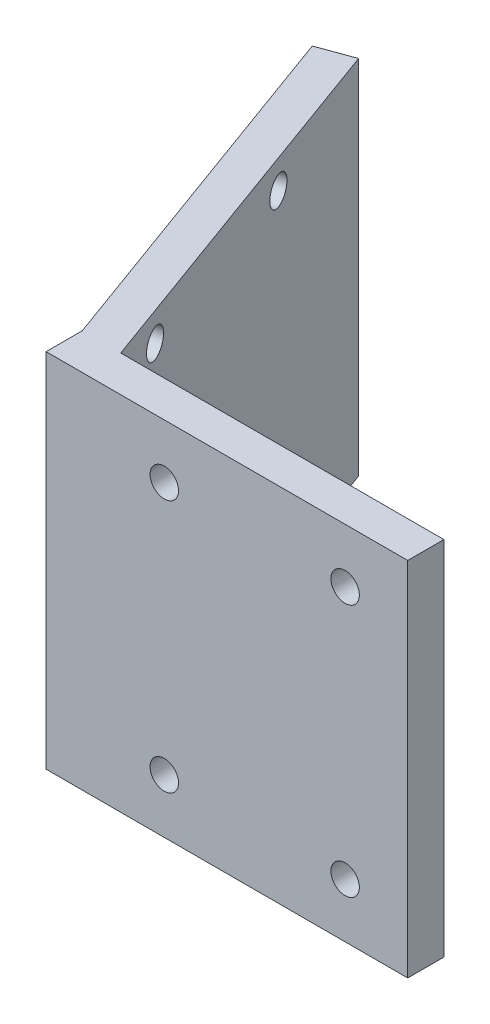
ISO-10303-21;
HEADER;
FILE_DESCRIPTION(('STEP AP214'),'2;1');
FILE_NAME('part.step','',(''),(''),'','','');
FILE_SCHEMA(('AUTOMOTIVE_DESIGN { 1 0 10303 214 1 1 1 1 }'));
ENDSEC;
DATA;
#1=APPLICATION_CONTEXT('core data for automotive mechanical design processes');
#2=APPLICATION_PROTOCOL_DEFINITION('international standard','automotive_design',2000,#1);
#3=PRODUCT_CONTEXT('',#1,'mechanical');
#4=PRODUCT('Part','Part','',(#3));
#5=PRODUCT_RELATED_PRODUCT_CATEGORY('part','',(#4));
#6=PRODUCT_DEFINITION_FORMATION('','',#4);
#7=PRODUCT_DEFINITION_CONTEXT('part definition',#1,'design');
#8=PRODUCT_DEFINITION('design','',#6,#7);
#9=PRODUCT_DEFINITION_SHAPE('','',#8);
#10=(LENGTH_UNIT() NAMED_UNIT(*) SI_UNIT(.MILLI.,.METRE.));
#11=(NAMED_UNIT(*) PLANE_ANGLE_UNIT() SI_UNIT($,.RADIAN.));
#12=(NAMED_UNIT(*) SI_UNIT($,.STERADIAN.) SOLID_ANGLE_UNIT());
#13=UNCERTAINTY_MEASURE_WITH_UNIT(LENGTH_MEASURE(1.E-05),#10,'distance_accuracy_value','');
#14=(GEOMETRIC_REPRESENTATION_CONTEXT(3) GLOBAL_UNCERTAINTY_ASSIGNED_CONTEXT((#13)) GLOBAL_UNIT_ASSIGNED_CONTEXT((#10,
#11,#12)) REPRESENTATION_CONTEXT('',''));
#15=CARTESIAN_POINT('',(0.,0.,0.));
#16=DIRECTION('',(0.,0.,1.));
#17=DIRECTION('',(1.,0.,0.));
#18=AXIS2_PLACEMENT_3D('',#15,#16,#17);
#19=CARTESIAN_POINT('',(0.,25.4,0.));
#20=DIRECTION('',(0.939692620785908,0.,-0.34202014332567));
#21=DIRECTION('',(-0.34202014332567,0.,-0.939692620785908));
#22=AXIS2_PLACEMENT_3D('',#19,#20,#21);
#23=PLANE('',#22);
#24=CARTESIAN_POINT('',(-1.0616700011516,23.4,-2.91691435507637));
#25=DIRECTION('',(0.939692620785908,0.,-0.34202014332567));
#26=DIRECTION('',(-0.34202014332567,0.,-0.939692620785908));
#27=AXIS2_PLACEMENT_3D('',#24,#25,#26);
#28=CIRCLE('',#27,0.999999999999999);
#29=CARTESIAN_POINT('',(-0.719649857825928,23.4,-1.97722173429046));
#30=VERTEX_POINT('',#29);
#31=EDGE_CURVE('E165',#30,#30,#28,.T.);
#32=ORIENTED_EDGE('',*,*,#31,.T.);
#33=EDGE_LOOP('',(#32));
#34=FACE_BOUND('',#33,.T.);
#35=CARTESIAN_POINT('',(-1.0616700011516,2.,-2.91691435507637));
#36=DIRECTION('',(-0.939692620785908,0.,0.34202014332567));
#37=DIRECTION('',(0.34202014332567,0.,0.939692620785908));
#38=AXIS2_PLACEMENT_3D('',#35,#36,#37);
#39=CIRCLE('',#38,1.);
#40=CARTESIAN_POINT('',(-0.719649857825928,2.,-1.97722173429046));
#41=VERTEX_POINT('',#40);
#42=EDGE_CURVE('E155',#41,#41,#39,.T.);
#43=ORIENTED_EDGE('',*,*,#42,.F.);
#44=EDGE_LOOP('',(#43));
#45=FACE_BOUND('',#44,.T.);
#46=CARTESIAN_POINT('',(-6.02096207937381,23.4,-16.542457356472));
#47=DIRECTION('',(0.939692620785908,0.,-0.34202014332567));
#48=DIRECTION('',(-0.34202014332567,0.,-0.939692620785908));
#49=AXIS2_PLACEMENT_3D('',#46,#47,#48);
#50=CIRCLE('',#49,1.);
#51=CARTESIAN_POINT('',(-5.67894193604814,23.4,-15.6027647356861));
#52=VERTEX_POINT('',#51);
#53=EDGE_CURVE('E152',#52,#52,#50,.T.);
#54=ORIENTED_EDGE('',*,*,#53,.T.);
#55=EDGE_LOOP('',(#54));
#56=FACE_BOUND('',#55,.T.);
#57=CARTESIAN_POINT('',(-6.02096207937381,2.,-16.542457356472));
#58=DIRECTION('',(-0.939692620785908,0.,0.34202014332567));
#59=DIRECTION('',(0.34202014332567,0.,0.939692620785908));
#60=AXIS2_PLACEMENT_3D('',#57,#58,#59);
#61=CIRCLE('',#60,1.);
#62=CARTESIAN_POINT('',(-5.67894193604814,2.,-15.6027647356861));
#63=VERTEX_POINT('',#62);
#64=EDGE_CURVE('E149',#63,#63,#61,.T.);
#65=ORIENTED_EDGE('',*,*,#64,.F.);
#66=EDGE_LOOP('',(#65));
#67=FACE_BOUND('',#66,.T.);
#68=DIRECTION('',(0.34202014332567,0.,0.939692620785908));
#69=VECTOR('',#68,1.);
#70=CARTESIAN_POINT('',(0.,0.,0.));
#71=LINE('',#70,#69);
#72=CARTESIAN_POINT('',(-9.24484395036157,0.,-25.4));
#73=VERTEX_POINT('',#72);
#74=CARTESIAN_POINT('',(0.,0.,0.));
#75=VERTEX_POINT('',#74);
#76=EDGE_CURVE('E125',#73,#75,#71,.T.);
#77=ORIENTED_EDGE('',*,*,#76,.T.);
#78=DIRECTION('',(0.,-1.,0.));
#79=VECTOR('',#78,1.);
#80=CARTESIAN_POINT('',(0.,25.4,0.));
#81=LINE('',#80,#79);
#82=CARTESIAN_POINT('',(0.,25.4,0.));
#83=VERTEX_POINT('',#82);
#84=EDGE_CURVE('E11',#83,#75,#81,.T.);
#85=ORIENTED_EDGE('',*,*,#84,.F.);
#86=DIRECTION('',(0.34202014332567,0.,0.939692620785908));
#87=VECTOR('',#86,1.);
#88=CARTESIAN_POINT('',(0.,25.4,0.));
#89=LINE('',#88,#87);
#90=CARTESIAN_POINT('',(-9.24484395036157,25.4,-25.4));
#91=VERTEX_POINT('',#90);
#92=EDGE_CURVE('E138',#91,#83,#89,.T.);
#93=ORIENTED_EDGE('',*,*,#92,.F.);
#94=DIRECTION('',(0.,-1.,0.));
#95=VECTOR('',#94,1.);
#96=CARTESIAN_POINT('',(-9.24484395036157,25.4,-25.4));
#97=LINE('',#96,#95);
#98=EDGE_CURVE('E121',#91,#73,#97,.T.);
#99=ORIENTED_EDGE('',*,*,#98,.T.);
#100=EDGE_LOOP('',(#77,#85,#93,#99));
#101=FACE_BOUND('',#100,.T.);
#102=ADVANCED_FACE('F33',(#34,#45,#56,#67,#101),#23,.F.);
#103=CARTESIAN_POINT('',(0.,25.4,0.));
#104=DIRECTION('',(1.,0.,0.));
#105=DIRECTION('',(0.,0.,-1.));
#106=AXIS2_PLACEMENT_3D('',#103,#104,#105);
#107=PLANE('',#106);
#108=DIRECTION('',(0.,0.,1.));
#109=VECTOR('',#108,1.);
#110=CARTESIAN_POINT('',(0.,0.,0.));
#111=LINE('',#110,#109);
#112=CARTESIAN_POINT('',(0.,0.,2.54));
#113=VERTEX_POINT('',#112);
#114=EDGE_CURVE('E128',#75,#113,#111,.T.);
#115=ORIENTED_EDGE('',*,*,#114,.T.);
#116=DIRECTION('',(0.,-1.,0.));
#117=VECTOR('',#116,1.);
#118=CARTESIAN_POINT('',(0.,25.4,2.54));
#119=LINE('',#118,#117);
#120=CARTESIAN_POINT('',(0.,25.4,2.54));
#121=VERTEX_POINT('',#120);
#122=EDGE_CURVE('E42',#121,#113,#119,.T.);
#123=ORIENTED_EDGE('',*,*,#122,.F.);
#124=DIRECTION('',(0.,0.,1.));
#125=VECTOR('',#124,1.);
#126=CARTESIAN_POINT('',(0.,25.4,0.));
#127=LINE('',#126,#125);
#128=EDGE_CURVE('E90',#83,#121,#127,.T.);
#129=ORIENTED_EDGE('',*,*,#128,.F.);
#130=ORIENTED_EDGE('',*,*,#84,.T.);
#131=EDGE_LOOP('',(#115,#123,#129,#130));
#132=FACE_BOUND('',#131,.T.);
#133=ADVANCED_FACE('F200',(#132),#107,.F.);
#134=CARTESIAN_POINT('',(0.,25.4,2.54));
#135=DIRECTION('',(0.,0.,-1.));
#136=DIRECTION('',(-1.,0.,0.));
#137=AXIS2_PLACEMENT_3D('',#134,#135,#136);
#138=PLANE('',#137);
#139=CARTESIAN_POINT('',(21.0014964955635,3.81,2.54));
#140=DIRECTION('',(0.,0.,-1.));
#141=DIRECTION('',(-1.,0.,0.));
#142=AXIS2_PLACEMENT_3D('',#139,#140,#141);
#143=CIRCLE('',#142,1.);
#144=CARTESIAN_POINT('',(20.0014964955635,3.81,2.54));
#145=VERTEX_POINT('',#144);
#146=EDGE_CURVE('E257',#145,#145,#143,.T.);
#147=ORIENTED_EDGE('',*,*,#146,.T.);
#148=EDGE_LOOP('',(#147));
#149=FACE_BOUND('',#148,.T.);
#150=CARTESIAN_POINT('',(8.30149649556353,21.59,2.54));
#151=DIRECTION('',(0.,0.,-1.));
#152=DIRECTION('',(-1.,0.,0.));
#153=AXIS2_PLACEMENT_3D('',#150,#151,#152);
#154=CIRCLE('',#153,1.);
#155=CARTESIAN_POINT('',(7.30149649556353,21.59,2.54));
#156=VERTEX_POINT('',#155);
#157=EDGE_CURVE('E260',#156,#156,#154,.T.);
#158=ORIENTED_EDGE('',*,*,#157,.T.);
#159=EDGE_LOOP('',(#158));
#160=FACE_BOUND('',#159,.T.);
#161=CARTESIAN_POINT('',(8.30149649556353,3.81,2.54));
#162=DIRECTION('',(0.,0.,-1.));
#163=DIRECTION('',(-1.,0.,0.));
#164=AXIS2_PLACEMENT_3D('',#161,#162,#163);
#165=CIRCLE('',#164,1.);
#166=CARTESIAN_POINT('',(7.30149649556353,3.81,2.54));
#167=VERTEX_POINT('',#166);
#168=EDGE_CURVE('E266',#167,#167,#165,.T.);
#169=ORIENTED_EDGE('',*,*,#168,.T.);
#170=EDGE_LOOP('',(#169));
#171=FACE_BOUND('',#170,.T.);
#172=CARTESIAN_POINT('',(21.0014964955635,21.59,2.54));
#173=DIRECTION('',(0.,0.,-1.));
#174=DIRECTION('',(-1.,0.,0.));
#175=AXIS2_PLACEMENT_3D('',#172,#173,#174);
#176=CIRCLE('',#175,1.);
#177=CARTESIAN_POINT('',(20.0014964955635,21.59,2.54));
#178=VERTEX_POINT('',#177);
#179=EDGE_CURVE('E263',#178,#178,#176,.T.);
#180=ORIENTED_EDGE('',*,*,#179,.T.);
#181=EDGE_LOOP('',(#180));
#182=FACE_BOUND('',#181,.T.);
#183=DIRECTION('',(1.,0.,0.));
#184=VECTOR('',#183,1.);
#185=CARTESIAN_POINT('',(0.,0.,2.54));
#186=LINE('',#185,#184);
#187=CARTESIAN_POINT('',(25.4,0.,2.54));
#188=VERTEX_POINT('',#187);
#189=EDGE_CURVE('E131',#113,#188,#186,.T.);
#190=ORIENTED_EDGE('',*,*,#189,.T.);
#191=DIRECTION('',(0.,-1.,0.));
#192=VECTOR('',#191,1.);
#193=CARTESIAN_POINT('',(25.4,25.4,2.54));
#194=LINE('',#193,#192);
#195=CARTESIAN_POINT('',(25.4,25.4,2.54));
#196=VERTEX_POINT('',#195);
#197=EDGE_CURVE('E142',#196,#188,#194,.T.);
#198=ORIENTED_EDGE('',*,*,#197,.F.);
#199=DIRECTION('',(1.,0.,0.));
#200=VECTOR('',#199,1.);
#201=CARTESIAN_POINT('',(0.,25.4,2.54));
#202=LINE('',#201,#200);
#203=EDGE_CURVE('E173',#121,#196,#202,.T.);
#204=ORIENTED_EDGE('',*,*,#203,.F.);
#205=ORIENTED_EDGE('',*,*,#122,.T.);
#206=EDGE_LOOP('',(#190,#198,#204,#205));
#207=FACE_BOUND('',#206,.T.);
#208=ADVANCED_FACE('F177',(#149,#160,#171,#182,#207),#138,.F.);
#209=CARTESIAN_POINT('',(25.4,25.4,0.));
#210=DIRECTION('',(-1.,0.,0.));
#211=DIRECTION('',(0.,0.,1.));
#212=AXIS2_PLACEMENT_3D('',#209,#210,#211);
#213=PLANE('',#212);
#214=DIRECTION('',(0.,0.,-1.));
#215=VECTOR('',#214,1.);
#216=CARTESIAN_POINT('',(25.4,0.,0.));
#217=LINE('',#216,#215);
#218=CARTESIAN_POINT('',(25.4,0.,0.));
#219=VERTEX_POINT('',#218);
#220=EDGE_CURVE('E133',#188,#219,#217,.T.);
#221=ORIENTED_EDGE('',*,*,#220,.T.);
#222=DIRECTION('',(0.,-1.,0.));
#223=VECTOR('',#222,1.);
#224=CARTESIAN_POINT('',(25.4,25.4,0.));
#225=LINE('',#224,#223);
#226=CARTESIAN_POINT('',(25.4,25.4,0.));
#227=VERTEX_POINT('',#226);
#228=EDGE_CURVE('E116',#227,#219,#225,.T.);
#229=ORIENTED_EDGE('',*,*,#228,.F.);
#230=DIRECTION('',(0.,0.,-1.));
#231=VECTOR('',#230,1.);
#232=CARTESIAN_POINT('',(25.4,25.4,0.));
#233=LINE('',#232,#231);
#234=EDGE_CURVE('E106',#196,#227,#233,.T.);
#235=ORIENTED_EDGE('',*,*,#234,.F.);
#236=ORIENTED_EDGE('',*,*,#197,.T.);
#237=EDGE_LOOP('',(#221,#229,#235,#236));
#238=FACE_BOUND('',#237,.T.);
#239=ADVANCED_FACE('F181',(#238),#213,.F.);
#240=CARTESIAN_POINT('',(2.70301154208882,25.4,0.));
#241=DIRECTION('',(0.,0.,1.));
#242=DIRECTION('',(1.,0.,0.));
#243=AXIS2_PLACEMENT_3D('',#240,#241,#242);
#244=PLANE('',#243);
#245=CARTESIAN_POINT('',(21.0014964955635,3.81,0.));
#246=DIRECTION('',(0.,0.,-1.));
#247=DIRECTION('',(1.,0.,0.));
#248=AXIS2_PLACEMENT_3D('',#245,#246,#247);
#249=CIRCLE('',#248,1.);
#250=CARTESIAN_POINT('',(22.0014964955635,3.81,0.));
#251=VERTEX_POINT('',#250);
#252=EDGE_CURVE('E254',#251,#251,#249,.T.);
#253=ORIENTED_EDGE('',*,*,#252,.F.);
#254=EDGE_LOOP('',(#253));
#255=FACE_BOUND('',#254,.T.);
#256=CARTESIAN_POINT('',(8.30149649556353,21.59,0.));
#257=DIRECTION('',(0.,0.,-1.));
#258=DIRECTION('',(1.,0.,0.));
#259=AXIS2_PLACEMENT_3D('',#256,#257,#258);
#260=CIRCLE('',#259,1.);
#261=CARTESIAN_POINT('',(9.30149649556353,21.59,0.));
#262=VERTEX_POINT('',#261);
#263=EDGE_CURVE('E289',#262,#262,#260,.T.);
#264=ORIENTED_EDGE('',*,*,#263,.F.);
#265=EDGE_LOOP('',(#264));
#266=FACE_BOUND('',#265,.T.);
#267=CARTESIAN_POINT('',(8.30149649556353,3.81,0.));
#268=DIRECTION('',(0.,0.,-1.));
#269=DIRECTION('',(-1.,0.,0.));
#270=AXIS2_PLACEMENT_3D('',#267,#268,#269);
#271=CIRCLE('',#270,1.);
#272=CARTESIAN_POINT('',(7.30149649556353,3.81,0.));
#273=VERTEX_POINT('',#272);
#274=EDGE_CURVE('E293',#273,#273,#271,.T.);
#275=ORIENTED_EDGE('',*,*,#274,.F.);
#276=EDGE_LOOP('',(#275));
#277=FACE_BOUND('',#276,.T.);
#278=CARTESIAN_POINT('',(21.0014964955635,21.59,0.));
#279=DIRECTION('',(0.,0.,-1.));
#280=DIRECTION('',(-1.,0.,0.));
#281=AXIS2_PLACEMENT_3D('',#278,#279,#280);
#282=CIRCLE('',#281,1.);
#283=CARTESIAN_POINT('',(20.0014964955635,21.59,0.));
#284=VERTEX_POINT('',#283);
#285=EDGE_CURVE('E259',#284,#284,#282,.T.);
#286=ORIENTED_EDGE('',*,*,#285,.F.);
#287=EDGE_LOOP('',(#286));
#288=FACE_BOUND('',#287,.T.);
#289=DIRECTION('',(-1.,0.,0.));
#290=VECTOR('',#289,1.);
#291=CARTESIAN_POINT('',(2.70301154208882,0.,0.));
#292=LINE('',#291,#290);
#293=CARTESIAN_POINT('',(2.70301154208882,0.,0.));
#294=VERTEX_POINT('',#293);
#295=EDGE_CURVE('E115',#219,#294,#292,.T.);
#296=ORIENTED_EDGE('',*,*,#295,.T.);
#297=DIRECTION('',(0.,-1.,0.));
#298=VECTOR('',#297,1.);
#299=CARTESIAN_POINT('',(2.70301154208882,25.4,0.));
#300=LINE('',#299,#298);
#301=CARTESIAN_POINT('',(2.70301154208882,25.4,0.));
#302=VERTEX_POINT('',#301);
#303=EDGE_CURVE('E112',#302,#294,#300,.T.);
#304=ORIENTED_EDGE('',*,*,#303,.F.);
#305=DIRECTION('',(-1.,0.,0.));
#306=VECTOR('',#305,1.);
#307=CARTESIAN_POINT('',(2.70301154208882,25.4,0.));
#308=LINE('',#307,#306);
#309=EDGE_CURVE('E100',#227,#302,#308,.T.);
#310=ORIENTED_EDGE('',*,*,#309,.F.);
#311=ORIENTED_EDGE('',*,*,#228,.T.);
#312=EDGE_LOOP('',(#296,#304,#310,#311));
#313=FACE_BOUND('',#312,.T.);
#314=ADVANCED_FACE('F113',(#255,#266,#277,#288,#313),#244,.F.);
#315=CARTESIAN_POINT('',(2.38681925679621,25.4,-0.868731164047201));
#316=DIRECTION('',(-0.939692620785908,0.,0.34202014332567));
#317=DIRECTION('',(0.34202014332567,0.,0.939692620785908));
#318=AXIS2_PLACEMENT_3D('',#315,#316,#317);
#319=PLANE('',#318);
#320=CARTESIAN_POINT('',(1.32514925564461,23.4,-3.78564551912357));
#321=DIRECTION('',(-0.939692620785908,0.,0.34202014332567));
#322=DIRECTION('',(0.34202014332567,0.,0.939692620785908));
#323=AXIS2_PLACEMENT_3D('',#320,#321,#322);
#324=CIRCLE('',#323,0.999999999999999);
#325=CARTESIAN_POINT('',(1.66716939897028,23.4,-2.84595289833766));
#326=VERTEX_POINT('',#325);
#327=EDGE_CURVE('E36',#326,#326,#324,.F.);
#328=ORIENTED_EDGE('',*,*,#327,.F.);
#329=EDGE_LOOP('',(#328));
#330=FACE_BOUND('',#329,.T.);
#331=CARTESIAN_POINT('',(1.32514925564461,2.,-3.78564551912357));
#332=DIRECTION('',(-0.939692620785908,0.,0.34202014332567));
#333=DIRECTION('',(0.34202014332567,0.,0.939692620785908));
#334=AXIS2_PLACEMENT_3D('',#331,#332,#333);
#335=CIRCLE('',#334,1.);
#336=CARTESIAN_POINT('',(1.66716939897028,2.,-2.84595289833766));
#337=VERTEX_POINT('',#336);
#338=EDGE_CURVE('E153',#337,#337,#335,.T.);
#339=ORIENTED_EDGE('',*,*,#338,.T.);
#340=EDGE_LOOP('',(#339));
#341=FACE_BOUND('',#340,.T.);
#342=CARTESIAN_POINT('',(-3.6341428225776,23.4,-17.4111885205192));
#343=DIRECTION('',(-0.939692620785908,0.,0.34202014332567));
#344=DIRECTION('',(0.34202014332567,0.,0.939692620785908));
#345=AXIS2_PLACEMENT_3D('',#342,#343,#344);
#346=CIRCLE('',#345,1.);
#347=CARTESIAN_POINT('',(-3.29212267925192,23.4,-16.4714958997333));
#348=VERTEX_POINT('',#347);
#349=EDGE_CURVE('E150',#348,#348,#346,.F.);
#350=ORIENTED_EDGE('',*,*,#349,.F.);
#351=EDGE_LOOP('',(#350));
#352=FACE_BOUND('',#351,.T.);
#353=CARTESIAN_POINT('',(-3.6341428225776,2.,-17.4111885205192));
#354=DIRECTION('',(-0.939692620785908,0.,0.34202014332567));
#355=DIRECTION('',(0.34202014332567,0.,0.939692620785908));
#356=AXIS2_PLACEMENT_3D('',#353,#354,#355);
#357=CIRCLE('',#356,1.);
#358=CARTESIAN_POINT('',(-3.29212267925193,2.,-16.4714958997333));
#359=VERTEX_POINT('',#358);
#360=EDGE_CURVE('E129',#359,#359,#357,.T.);
#361=ORIENTED_EDGE('',*,*,#360,.T.);
#362=EDGE_LOOP('',(#361));
#363=FACE_BOUND('',#362,.T.);
#364=DIRECTION('',(-0.34202014332567,0.,-0.939692620785908));
#365=VECTOR('',#364,1.);
#366=CARTESIAN_POINT('',(2.38681925679621,0.,-0.868731164047201));
#367=LINE('',#366,#365);
#368=CARTESIAN_POINT('',(-6.85802469356536,0.,-26.2687311640472));
#369=VERTEX_POINT('',#368);
#370=EDGE_CURVE('E76',#294,#369,#367,.T.);
#371=ORIENTED_EDGE('',*,*,#370,.T.);
#372=DIRECTION('',(0.,-1.,0.));
#373=VECTOR('',#372,1.);
#374=CARTESIAN_POINT('',(-6.85802469356536,25.4,-26.2687311640472));
#375=LINE('',#374,#373);
#376=CARTESIAN_POINT('',(-6.85802469356536,25.4,-26.2687311640472));
#377=VERTEX_POINT('',#376);
#378=EDGE_CURVE('E117',#377,#369,#375,.T.);
#379=ORIENTED_EDGE('',*,*,#378,.F.);
#380=DIRECTION('',(-0.342020143325669,0.,-0.939692620785908));
#381=VECTOR('',#380,1.);
#382=CARTESIAN_POINT('',(2.38681925679621,25.4,-0.868731164047201));
#383=LINE('',#382,#381);
#384=EDGE_CURVE('E104',#302,#377,#383,.T.);
#385=ORIENTED_EDGE('',*,*,#384,.F.);
#386=ORIENTED_EDGE('',*,*,#303,.T.);
#387=EDGE_LOOP('',(#371,#379,#385,#386));
#388=FACE_BOUND('',#387,.T.);
#389=ADVANCED_FACE('F119',(#330,#341,#352,#363,#388),#319,.F.);
#390=CARTESIAN_POINT('',(-9.24484395036157,25.4,-25.4));
#391=DIRECTION('',(0.34202014332567,0.,0.939692620785908));
#392=DIRECTION('',(0.939692620785908,0.,-0.34202014332567));
#393=AXIS2_PLACEMENT_3D('',#390,#391,#392);
#394=PLANE('',#393);
#395=DIRECTION('',(-0.939692620785908,0.,0.34202014332567));
#396=VECTOR('',#395,1.);
#397=CARTESIAN_POINT('',(-9.24484395036157,0.,-25.4));
#398=LINE('',#397,#396);
#399=EDGE_CURVE('E82',#369,#73,#398,.T.);
#400=ORIENTED_EDGE('',*,*,#399,.T.);
#401=ORIENTED_EDGE('',*,*,#98,.F.);
#402=DIRECTION('',(-0.939692620785908,0.,0.34202014332567));
#403=VECTOR('',#402,1.);
#404=CARTESIAN_POINT('',(-9.24484395036157,25.4,-25.4));
#405=LINE('',#404,#403);
#406=EDGE_CURVE('E51',#377,#91,#405,.T.);
#407=ORIENTED_EDGE('',*,*,#406,.F.);
#408=ORIENTED_EDGE('',*,*,#378,.T.);
#409=EDGE_LOOP('',(#400,#401,#407,#408));
#410=FACE_BOUND('',#409,.T.);
#411=ADVANCED_FACE('F188',(#410),#394,.F.);
#412=CARTESIAN_POINT('',(0.,25.4,0.));
#413=DIRECTION('',(0.,-1.,0.));
#414=DIRECTION('',(0.,0.,-1.));
#415=AXIS2_PLACEMENT_3D('',#412,#413,#414);
#416=PLANE('',#415);
#417=ORIENTED_EDGE('',*,*,#92,.T.);
#418=ORIENTED_EDGE('',*,*,#128,.T.);
#419=ORIENTED_EDGE('',*,*,#203,.T.);
#420=ORIENTED_EDGE('',*,*,#234,.T.);
#421=ORIENTED_EDGE('',*,*,#309,.T.);
#422=ORIENTED_EDGE('',*,*,#384,.T.);
#423=ORIENTED_EDGE('',*,*,#406,.T.);
#424=EDGE_LOOP('',(#417,#418,#419,#420,#421,#422,#423));
#425=FACE_BOUND('',#424,.T.);
#426=ADVANCED_FACE('F102',(#425),#416,.F.);
#427=CARTESIAN_POINT('',(0.,0.,0.));
#428=DIRECTION('',(0.,-1.,0.));
#429=DIRECTION('',(0.,0.,-1.));
#430=AXIS2_PLACEMENT_3D('',#427,#428,#429);
#431=PLANE('',#430);
#432=ORIENTED_EDGE('',*,*,#76,.F.);
#433=ORIENTED_EDGE('',*,*,#399,.F.);
#434=ORIENTED_EDGE('',*,*,#370,.F.);
#435=ORIENTED_EDGE('',*,*,#295,.F.);
#436=ORIENTED_EDGE('',*,*,#220,.F.);
#437=ORIENTED_EDGE('',*,*,#189,.F.);
#438=ORIENTED_EDGE('',*,*,#114,.F.);
#439=EDGE_LOOP('',(#432,#433,#434,#435,#436,#437,#438));
#440=FACE_BOUND('',#439,.T.);
#441=ADVANCED_FACE('F184',(#440),#431,.T.);
#442=CARTESIAN_POINT('',(17.8472304885883,2.,-25.229768996944));
#443=DIRECTION('',(-0.939692620785908,0.,0.34202014332567));
#444=DIRECTION('',(0.34202014332567,0.,0.939692620785908));
#445=AXIS2_PLACEMENT_3D('',#442,#443,#444);
#446=CYLINDRICAL_SURFACE('',#445,1.);
#447=ORIENTED_EDGE('',*,*,#64,.T.);
#448=EDGE_LOOP('',(#447));
#449=FACE_BOUND('',#448,.T.);
#450=ORIENTED_EDGE('',*,*,#360,.F.);
#451=EDGE_LOOP('',(#450));
#452=FACE_BOUND('',#451,.T.);
#453=ADVANCED_FACE('F213',(#449,#452),#446,.F.);
#454=CARTESIAN_POINT('',(17.8472304885883,23.4,-25.229768996944));
#455=DIRECTION('',(-0.939692620785908,0.,0.34202014332567));
#456=DIRECTION('',(0.34202014332567,0.,0.939692620785908));
#457=AXIS2_PLACEMENT_3D('',#454,#455,#456);
#458=CYLINDRICAL_SURFACE('',#457,1.);
#459=CARTESIAN_POINT('',(-5.67894193604814,23.4,-15.6027647356861));
#460=CARTESIAN_POINT('',(-5.65407923545651,23.4,-15.6118140186449));
#461=CARTESIAN_POINT('',(-5.62921653486488,23.4,-15.6208633016038));
#462=CARTESIAN_POINT('',(-5.57949113368163,23.4,-15.6389618675214));
#463=CARTESIAN_POINT('',(-5.55462843309,23.4,-15.6480111504802));
#464=CARTESIAN_POINT('',(-5.50490303190675,23.4,-15.6661097163979));
#465=CARTESIAN_POINT('',(-5.48004033131512,23.4,-15.6751589993567));
#466=CARTESIAN_POINT('',(-5.43031493013186,23.4,-15.6932575652744));
#467=CARTESIAN_POINT('',(-5.40545222954024,23.4,-15.7023068482332));
#468=CARTESIAN_POINT('',(-5.35572682835698,23.4,-15.7204054141508));
#469=CARTESIAN_POINT('',(-5.33086412776535,23.4,-15.7294546971097));
#470=CARTESIAN_POINT('',(-5.2811387265821,23.4,-15.7475532630273));
#471=CARTESIAN_POINT('',(-5.25627602599047,23.4,-15.7566025459861));
#472=CARTESIAN_POINT('',(-5.20655062480722,23.4,-15.7747011119038));
#473=CARTESIAN_POINT('',(-5.18168792421559,23.4,-15.7837503948626));
#474=CARTESIAN_POINT('',(-5.13196252303234,23.4,-15.8018489607803));
#475=CARTESIAN_POINT('',(-5.10709982244071,23.4,-15.8108982437391));
#476=CARTESIAN_POINT('',(-5.05737442125746,23.4,-15.8289968096567));
#477=CARTESIAN_POINT('',(-5.03251172066583,23.4,-15.8380460926156));
#478=CARTESIAN_POINT('',(-4.98278631948258,23.4,-15.8561446585332));
#479=CARTESIAN_POINT('',(-4.95792361889095,23.4,-15.8651939414921));
#480=CARTESIAN_POINT('',(-4.90819821770769,23.4,-15.8832925074097));
#481=CARTESIAN_POINT('',(-4.88333551711607,23.4,-15.8923417903685));
#482=CARTESIAN_POINT('',(-4.83361011593281,23.4,-15.9104403562862));
#483=CARTESIAN_POINT('',(-4.80874741534118,23.4,-15.919489639245));
#484=CARTESIAN_POINT('',(-4.75902201415793,23.4,-15.9375882051626));
#485=CARTESIAN_POINT('',(-4.7341593135663,23.4,-15.9466374881215));
#486=CARTESIAN_POINT('',(-4.68443391238305,23.4,-15.9647360540391));
#487=CARTESIAN_POINT('',(-4.65957121179142,23.4,-15.973785336998));
#488=CARTESIAN_POINT('',(-4.60984581060817,23.4,-15.9918839029156));
#489=CARTESIAN_POINT('',(-4.58498311001654,23.4,-16.0009331858744));
#490=CARTESIAN_POINT('',(-4.53525770883329,23.4,-16.0190317517921));
#491=CARTESIAN_POINT('',(-4.51039500824166,23.4,-16.0280810347509));
#492=CARTESIAN_POINT('',(-4.4606696070584,23.4,-16.0461796006686));
#493=CARTESIAN_POINT('',(-4.43580690646678,23.4,-16.0552288836274));
#494=CARTESIAN_POINT('',(-4.38608150528352,23.4,-16.073327449545));
#495=CARTESIAN_POINT('',(-4.3612188046919,23.4,-16.0823767325039));
#496=CARTESIAN_POINT('',(-4.31149340350864,23.4,-16.1004752984215));
#497=CARTESIAN_POINT('',(-4.28663070291701,23.4,-16.1095245813803));
#498=CARTESIAN_POINT('',(-4.23690530173376,23.4,-16.127623147298));
#499=CARTESIAN_POINT('',(-4.21204260114213,23.4,-16.1366724302568));
#500=CARTESIAN_POINT('',(-4.16231719995887,23.4,-16.1547709961745));
#501=CARTESIAN_POINT('',(-4.13745449936725,23.4,-16.1638202791333));
#502=CARTESIAN_POINT('',(-4.08772909818399,23.4,-16.1819188450509));
#503=CARTESIAN_POINT('',(-4.06286639759237,23.4,-16.1909681280098));
#504=CARTESIAN_POINT('',(-4.01314099640911,23.4,-16.2090666939274));
#505=CARTESIAN_POINT('',(-3.98827829581749,23.4,-16.2181159768862));
#506=CARTESIAN_POINT('',(-3.93855289463423,23.4,-16.2362145428039));
#507=CARTESIAN_POINT('',(-3.91369019404261,23.4,-16.2452638257627));
#508=CARTESIAN_POINT('',(-3.86396479285935,23.4,-16.2633623916804));
#509=CARTESIAN_POINT('',(-3.83910209226772,23.4,-16.2724116746392));
#510=CARTESIAN_POINT('',(-3.78937669108447,23.4,-16.2905102405568));
#511=CARTESIAN_POINT('',(-3.76451399049284,23.4,-16.2995595235157));
#512=CARTESIAN_POINT('',(-3.71478858930959,23.4,-16.3176580894333));
#513=CARTESIAN_POINT('',(-3.68992588871796,23.4,-16.3267073723921));
#514=CARTESIAN_POINT('',(-3.64020048753471,23.4,-16.3448059383098));
#515=CARTESIAN_POINT('',(-3.61533778694308,23.4,-16.3538552212686));
#516=CARTESIAN_POINT('',(-3.56561238575982,23.4,-16.3719537871863));
#517=CARTESIAN_POINT('',(-3.54074968516819,23.4,-16.3810030701451));
#518=CARTESIAN_POINT('',(-3.49102428398494,23.4,-16.3991016360627));
#519=CARTESIAN_POINT('',(-3.46616158339331,23.4,-16.4081509190216));
#520=CARTESIAN_POINT('',(-3.41643618221006,23.4,-16.4262494849392));
#521=CARTESIAN_POINT('',(-3.39157348161843,23.4,-16.435298767898));
#522=CARTESIAN_POINT('',(-3.34184808043518,23.4,-16.4533973338157));
#523=CARTESIAN_POINT('',(-3.31698537984355,23.4,-16.4624466167745));
#524=CARTESIAN_POINT('',(-3.29212267925192,23.4,-16.4714958997333));
#525=B_SPLINE_CURVE_WITH_KNOTS('',3,(#459,#460,#461,#462,#463,#464,#465,#466,#467,#468,#469,
#470,#471,#472,#473,#474,#475,#476,#477,#478,#479,#480,#481,#482,#483,#484,#485,#486,#487,#488,
#489,#490,#491,#492,#493,#494,#495,#496,#497,#498,#499,#500,#501,#502,#503,#504,#505,#506,#507,
#508,#509,#510,#511,#512,#513,#514,#515,#516,#517,#518,#519,#520,#521,#522,#523,#524),
.UNSPECIFIED.,.F.,.F.,(4,2,2,2,2,2,2,2,2,2,2,2,2,2,2,2,2,2,2,2,2,2,2,2,2,2,2,2,2,2,2,2,4),(0.,
0.0793749999999989,0.158749999999998,0.238125000000005,0.317500000000004,0.396875000000002,
0.476250000000001,0.555625,0.635000000000004,0.714375000000003,0.793750000000003,
0.873125000000005,0.952500000000004,1.031875,1.11125,1.190625,1.27,1.349375,1.42875,
1.50812500000001,1.58750000000001,1.66687500000001,1.74625000000001,1.825625,1.905,
1.98437500000001,2.06375000000001,2.14312500000001,2.22250000000001,2.30187500000001,
2.38125000000001,2.46062500000001,2.54000000000001),.UNSPECIFIED.);
#526=EDGE_CURVE('BSEAM216',#52,#348,#525,.T.);
#527=ORIENTED_EDGE('',*,*,#53,.F.);
#528=ORIENTED_EDGE('',*,*,#349,.T.);
#529=ORIENTED_EDGE('',*,*,#526,.T.);
#530=ORIENTED_EDGE('',*,*,#526,.F.);
#531=EDGE_LOOP('',(#527,#529,#528,#530));
#532=FACE_BOUND('',#531,.T.);
#533=ADVANCED_FACE('F216',(#532),#458,.F.);
#534=CARTESIAN_POINT('',(22.8065225668105,2.,-11.6042259955484));
#535=DIRECTION('',(-0.939692620785908,0.,0.34202014332567));
#536=DIRECTION('',(0.34202014332567,0.,0.939692620785908));
#537=AXIS2_PLACEMENT_3D('',#534,#535,#536);
#538=CYLINDRICAL_SURFACE('',#537,1.);
#539=CARTESIAN_POINT('',(-0.719649857825928,2.,-1.97722173429046));
#540=CARTESIAN_POINT('',(-0.694787157234301,2.,-1.98627101724928));
#541=CARTESIAN_POINT('',(-0.669924456642674,2.,-1.99532030020811));
#542=CARTESIAN_POINT('',(-0.62019905545942,2.,-2.01341886612576));
#543=CARTESIAN_POINT('',(-0.595336354867793,2.,-2.02246814908458));
#544=CARTESIAN_POINT('',(-0.545610953684538,2.,-2.04056671500223));
#545=CARTESIAN_POINT('',(-0.52074825309291,2.,-2.04961599796106));
#546=CARTESIAN_POINT('',(-0.471022851909655,2.,-2.06771456387871));
#547=CARTESIAN_POINT('',(-0.446160151318029,2.,-2.07676384683753));
#548=CARTESIAN_POINT('',(-0.396434750134774,2.,-2.09486241275518));
#549=CARTESIAN_POINT('',(-0.371572049543145,2.,-2.10391169571401));
#550=CARTESIAN_POINT('',(-0.321846648359891,2.,-2.12201026163166));
#551=CARTESIAN_POINT('',(-0.296983947768264,2.,-2.13105954459048));
#552=CARTESIAN_POINT('',(-0.24725854658501,2.,-2.14915811050813));
#553=CARTESIAN_POINT('',(-0.222395845993383,2.,-2.15820739346696));
#554=CARTESIAN_POINT('',(-0.172670444810129,2.,-2.17630595938461));
#555=CARTESIAN_POINT('',(-0.147807744218502,2.,-2.18535524234343));
#556=CARTESIAN_POINT('',(-0.0980823430352488,2.,-2.20345380826108));
#557=CARTESIAN_POINT('',(-0.073219642443622,2.,-2.21250309121991));
#558=CARTESIAN_POINT('',(-0.0234942412603684,2.,-2.23060165713756));
#559=CARTESIAN_POINT('',(0.00136845933125854,2.,-2.23965094009638));
#560=CARTESIAN_POINT('',(0.0510938605145135,2.,-2.25774950601403));
#561=CARTESIAN_POINT('',(0.0759565611061416,2.,-2.26679878897286));
#562=CARTESIAN_POINT('',(0.125681962289398,2.,-2.28489735489051));
#563=CARTESIAN_POINT('',(0.150544662881026,2.,-2.29394663784933));
#564=CARTESIAN_POINT('',(0.200270064064281,2.,-2.31204520376698));
#565=CARTESIAN_POINT('',(0.225132764655907,2.,-2.32109448672581));
#566=CARTESIAN_POINT('',(0.274858165839161,2.,-2.33919305264346));
#567=CARTESIAN_POINT('',(0.299720866430788,2.,-2.34824233560228));
#568=CARTESIAN_POINT('',(0.349446267614042,2.,-2.36634090151993));
#569=CARTESIAN_POINT('',(0.374308968205669,2.,-2.37539018447876));
#570=CARTESIAN_POINT('',(0.424034369388922,2.,-2.39348875039641));
#571=CARTESIAN_POINT('',(0.448897069980549,2.,-2.40253803335524));
#572=CARTESIAN_POINT('',(0.498622471163803,2.,-2.42063659927288));
#573=CARTESIAN_POINT('',(0.52348517175543,2.,-2.42968588223171));
#574=CARTESIAN_POINT('',(0.573210572938684,2.,-2.44778444814936));
#575=CARTESIAN_POINT('',(0.59807327353031,2.,-2.45683373110819));
#576=CARTESIAN_POINT('',(0.647798674713565,2.,-2.47493229702584));
#577=CARTESIAN_POINT('',(0.672661375305193,2.,-2.48398157998466));
#578=CARTESIAN_POINT('',(0.722386776488449,2.,-2.50208014590231));
#579=CARTESIAN_POINT('',(0.747249477080075,2.,-2.51112942886113));
#580=CARTESIAN_POINT('',(0.79697487826333,2.,-2.52922799477878));
#581=CARTESIAN_POINT('',(0.821837578854958,2.,-2.53827727773761));
#582=CARTESIAN_POINT('',(0.871562980038213,2.,-2.55637584365526));
#583=CARTESIAN_POINT('',(0.89642568062984,2.,-2.56542512661409));
#584=CARTESIAN_POINT('',(0.946151081813094,2.,-2.58352369253174));
#585=CARTESIAN_POINT('',(0.97101378240472,2.,-2.59257297549056));
#586=CARTESIAN_POINT('',(1.02073918358797,2.,-2.61067154140821));
#587=CARTESIAN_POINT('',(1.0456018841796,2.,-2.61972082436703));
#588=CARTESIAN_POINT('',(1.09532728536286,2.,-2.63781939028468));
#589=CARTESIAN_POINT('',(1.12018998595448,2.,-2.64686867324351));
#590=CARTESIAN_POINT('',(1.16991538713774,2.,-2.66496723916116));
#591=CARTESIAN_POINT('',(1.19477808772936,2.,-2.67401652211998));
#592=CARTESIAN_POINT('',(1.24450348891262,2.,-2.69211508803763));
#593=CARTESIAN_POINT('',(1.26936618950424,2.,-2.70116437099646));
#594=CARTESIAN_POINT('',(1.3190915906875,2.,-2.71926293691411));
#595=CARTESIAN_POINT('',(1.34395429127913,2.,-2.72831221987294));
#596=CARTESIAN_POINT('',(1.39367969246238,2.,-2.74641078579059));
#597=CARTESIAN_POINT('',(1.41854239305401,2.,-2.75546006874941));
#598=CARTESIAN_POINT('',(1.46826779423727,2.,-2.77355863466706));
#599=CARTESIAN_POINT('',(1.49313049482889,2.,-2.78260791762588));
#600=CARTESIAN_POINT('',(1.54285589601215,2.,-2.80070648354353));
#601=CARTESIAN_POINT('',(1.56771859660377,2.,-2.80975576650236));
#602=CARTESIAN_POINT('',(1.61744399778703,2.,-2.82785433242001));
#603=CARTESIAN_POINT('',(1.64230669837865,2.,-2.83690361537884));
#604=CARTESIAN_POINT('',(1.66716939897028,2.,-2.84595289833766));
#605=B_SPLINE_CURVE_WITH_KNOTS('',3,(#539,#540,#541,#542,#543,#544,#545,#546,#547,#548,#549,
#550,#551,#552,#553,#554,#555,#556,#557,#558,#559,#560,#561,#562,#563,#564,#565,#566,#567,#568,
#569,#570,#571,#572,#573,#574,#575,#576,#577,#578,#579,#580,#581,#582,#583,#584,#585,#586,#587,
#588,#589,#590,#591,#592,#593,#594,#595,#596,#597,#598,#599,#600,#601,#602,#603,#604),
.UNSPECIFIED.,.F.,.F.,(4,2,2,2,2,2,2,2,2,2,2,2,2,2,2,2,2,2,2,2,2,2,2,2,2,2,2,2,2,2,2,2,4),(0.,
0.0793749999999989,0.158749999999998,0.238125000000001,0.3175,0.396875000000002,
0.476250000000002,0.555625000000001,0.635,0.714375,0.793749999999998,0.873125000000001,
0.952500000000003,1.031875,1.11125,1.190625,1.27,1.349375,1.42875,1.508125,1.5875,1.666875,
1.74625,1.825625,1.905,1.984375,2.06375,2.143125,2.22250000000001,2.301875,2.38125,2.460625,
2.54),.UNSPECIFIED.);
#606=EDGE_CURVE('BSEAM224',#41,#337,#605,.T.);
#607=ORIENTED_EDGE('',*,*,#42,.T.);
#608=ORIENTED_EDGE('',*,*,#338,.F.);
#609=ORIENTED_EDGE('',*,*,#606,.T.);
#610=ORIENTED_EDGE('',*,*,#606,.F.);
#611=EDGE_LOOP('',(#607,#609,#608,#610));
#612=FACE_BOUND('',#611,.T.);
#613=ADVANCED_FACE('F224',(#612),#538,.F.);
#614=CARTESIAN_POINT('',(22.8065225668105,23.4,-11.6042259955484));
#615=DIRECTION('',(-0.939692620785908,0.,0.34202014332567));
#616=DIRECTION('',(0.34202014332567,0.,0.939692620785908));
#617=AXIS2_PLACEMENT_3D('',#614,#615,#616);
#618=CYLINDRICAL_SURFACE('',#617,0.999999999999999);
#619=CARTESIAN_POINT('',(-0.719649857825928,23.4,-1.97722173429046));
#620=CARTESIAN_POINT('',(-0.694787157234301,23.4,-1.98627101724928));
#621=CARTESIAN_POINT('',(-0.669924456642674,23.4,-1.99532030020811));
#622=CARTESIAN_POINT('',(-0.62019905545942,23.4,-2.01341886612576));
#623=CARTESIAN_POINT('',(-0.595336354867793,23.4,-2.02246814908458));
#624=CARTESIAN_POINT('',(-0.545610953684538,23.4,-2.04056671500223));
#625=CARTESIAN_POINT('',(-0.52074825309291,23.4,-2.04961599796106));
#626=CARTESIAN_POINT('',(-0.471022851909655,23.4,-2.06771456387871));
#627=CARTESIAN_POINT('',(-0.446160151318029,23.4,-2.07676384683753));
#628=CARTESIAN_POINT('',(-0.396434750134774,23.4,-2.09486241275518));
#629=CARTESIAN_POINT('',(-0.371572049543145,23.4,-2.10391169571401));
#630=CARTESIAN_POINT('',(-0.321846648359891,23.4,-2.12201026163166));
#631=CARTESIAN_POINT('',(-0.296983947768264,23.4,-2.13105954459048));
#632=CARTESIAN_POINT('',(-0.24725854658501,23.4,-2.14915811050813));
#633=CARTESIAN_POINT('',(-0.222395845993383,23.4,-2.15820739346696));
#634=CARTESIAN_POINT('',(-0.172670444810129,23.4,-2.17630595938461));
#635=CARTESIAN_POINT('',(-0.147807744218502,23.4,-2.18535524234343));
#636=CARTESIAN_POINT('',(-0.0980823430352488,23.4,-2.20345380826108));
#637=CARTESIAN_POINT('',(-0.073219642443622,23.4,-2.21250309121991));
#638=CARTESIAN_POINT('',(-0.0234942412603684,23.4,-2.23060165713756));
#639=CARTESIAN_POINT('',(0.00136845933125854,23.4,-2.23965094009638));
#640=CARTESIAN_POINT('',(0.0510938605145135,23.4,-2.25774950601403));
#641=CARTESIAN_POINT('',(0.0759565611061416,23.4,-2.26679878897286));
#642=CARTESIAN_POINT('',(0.125681962289398,23.4,-2.28489735489051));
#643=CARTESIAN_POINT('',(0.150544662881026,23.4,-2.29394663784933));
#644=CARTESIAN_POINT('',(0.200270064064281,23.4,-2.31204520376698));
#645=CARTESIAN_POINT('',(0.225132764655907,23.4,-2.32109448672581));
#646=CARTESIAN_POINT('',(0.274858165839161,23.4,-2.33919305264346));
#647=CARTESIAN_POINT('',(0.299720866430788,23.4,-2.34824233560228));
#648=CARTESIAN_POINT('',(0.349446267614042,23.4,-2.36634090151993));
#649=CARTESIAN_POINT('',(0.374308968205669,23.4,-2.37539018447876));
#650=CARTESIAN_POINT('',(0.424034369388922,23.4,-2.39348875039641));
#651=CARTESIAN_POINT('',(0.448897069980549,23.4,-2.40253803335524));
#652=CARTESIAN_POINT('',(0.498622471163803,23.4,-2.42063659927288));
#653=CARTESIAN_POINT('',(0.52348517175543,23.4,-2.42968588223171));
#654=CARTESIAN_POINT('',(0.573210572938684,23.4,-2.44778444814936));
#655=CARTESIAN_POINT('',(0.59807327353031,23.4,-2.45683373110819));
#656=CARTESIAN_POINT('',(0.647798674713565,23.4,-2.47493229702584));
#657=CARTESIAN_POINT('',(0.672661375305193,23.4,-2.48398157998466));
#658=CARTESIAN_POINT('',(0.722386776488449,23.4,-2.50208014590231));
#659=CARTESIAN_POINT('',(0.747249477080075,23.4,-2.51112942886113));
#660=CARTESIAN_POINT('',(0.79697487826333,23.4,-2.52922799477878));
#661=CARTESIAN_POINT('',(0.821837578854958,23.4,-2.53827727773761));
#662=CARTESIAN_POINT('',(0.871562980038213,23.4,-2.55637584365526));
#663=CARTESIAN_POINT('',(0.89642568062984,23.4,-2.56542512661409));
#664=CARTESIAN_POINT('',(0.946151081813094,23.4,-2.58352369253174));
#665=CARTESIAN_POINT('',(0.97101378240472,23.4,-2.59257297549056));
#666=CARTESIAN_POINT('',(1.02073918358797,23.4,-2.61067154140821));
#667=CARTESIAN_POINT('',(1.0456018841796,23.4,-2.61972082436703));
#668=CARTESIAN_POINT('',(1.09532728536286,23.4,-2.63781939028468));
#669=CARTESIAN_POINT('',(1.12018998595448,23.4,-2.64686867324351));
#670=CARTESIAN_POINT('',(1.16991538713774,23.4,-2.66496723916116));
#671=CARTESIAN_POINT('',(1.19477808772936,23.4,-2.67401652211998));
#672=CARTESIAN_POINT('',(1.24450348891262,23.4,-2.69211508803763));
#673=CARTESIAN_POINT('',(1.26936618950424,23.4,-2.70116437099646));
#674=CARTESIAN_POINT('',(1.3190915906875,23.4,-2.71926293691411));
#675=CARTESIAN_POINT('',(1.34395429127913,23.4,-2.72831221987294));
#676=CARTESIAN_POINT('',(1.39367969246238,23.4,-2.74641078579059));
#677=CARTESIAN_POINT('',(1.41854239305401,23.4,-2.75546006874941));
#678=CARTESIAN_POINT('',(1.46826779423727,23.4,-2.77355863466706));
#679=CARTESIAN_POINT('',(1.49313049482889,23.4,-2.78260791762588));
#680=CARTESIAN_POINT('',(1.54285589601215,23.4,-2.80070648354353));
#681=CARTESIAN_POINT('',(1.56771859660377,23.4,-2.80975576650236));
#682=CARTESIAN_POINT('',(1.61744399778703,23.4,-2.82785433242001));
#683=CARTESIAN_POINT('',(1.64230669837865,23.4,-2.83690361537884));
#684=CARTESIAN_POINT('',(1.66716939897028,23.4,-2.84595289833766));
#685=B_SPLINE_CURVE_WITH_KNOTS('',3,(#619,#620,#621,#622,#623,#624,#625,#626,#627,#628,#629,
#630,#631,#632,#633,#634,#635,#636,#637,#638,#639,#640,#641,#642,#643,#644,#645,#646,#647,#648,
#649,#650,#651,#652,#653,#654,#655,#656,#657,#658,#659,#660,#661,#662,#663,#664,#665,#666,#667,
#668,#669,#670,#671,#672,#673,#674,#675,#676,#677,#678,#679,#680,#681,#682,#683,#684),
.UNSPECIFIED.,.F.,.F.,(4,2,2,2,2,2,2,2,2,2,2,2,2,2,2,2,2,2,2,2,2,2,2,2,2,2,2,2,2,2,2,2,4),(0.,
0.0793749999999989,0.158749999999998,0.238125000000001,0.3175,0.396875000000002,
0.476250000000002,0.555625000000001,0.635,0.714375,0.793749999999998,0.873125000000001,
0.952500000000003,1.031875,1.11125,1.190625,1.27,1.349375,1.42875,1.508125,1.5875,1.666875,
1.74625,1.825625,1.905,1.984375,2.06375,2.143125,2.22250000000001,2.301875,2.38125,2.460625,
2.54),.UNSPECIFIED.);
#686=EDGE_CURVE('BSEAM230',#30,#326,#685,.T.);
#687=ORIENTED_EDGE('',*,*,#31,.F.);
#688=ORIENTED_EDGE('',*,*,#327,.T.);
#689=ORIENTED_EDGE('',*,*,#686,.T.);
#690=ORIENTED_EDGE('',*,*,#686,.F.);
#691=EDGE_LOOP('',(#687,#689,#688,#690));
#692=FACE_BOUND('',#691,.T.);
#693=ADVANCED_FACE('F230',(#692),#618,.F.);
#694=CARTESIAN_POINT('',(21.0014964955635,21.59,25.4));
#695=DIRECTION('',(0.,0.,-1.));
#696=DIRECTION('',(-1.,0.,0.));
#697=AXIS2_PLACEMENT_3D('',#694,#695,#696);
#698=CYLINDRICAL_SURFACE('',#697,1.);
#699=ORIENTED_EDGE('',*,*,#285,.T.);
#700=EDGE_LOOP('',(#699));
#701=FACE_BOUND('',#700,.T.);
#702=ORIENTED_EDGE('',*,*,#179,.F.);
#703=EDGE_LOOP('',(#702));
#704=FACE_BOUND('',#703,.T.);
#705=ADVANCED_FACE('F233',(#701,#704),#698,.F.);
#706=CARTESIAN_POINT('',(8.30149649556353,3.81,25.4));
#707=DIRECTION('',(0.,0.,-1.));
#708=DIRECTION('',(-1.,0.,0.));
#709=AXIS2_PLACEMENT_3D('',#706,#707,#708);
#710=CYLINDRICAL_SURFACE('',#709,1.);
#711=ORIENTED_EDGE('',*,*,#274,.T.);
#712=EDGE_LOOP('',(#711));
#713=FACE_BOUND('',#712,.T.);
#714=ORIENTED_EDGE('',*,*,#168,.F.);
#715=EDGE_LOOP('',(#714));
#716=FACE_BOUND('',#715,.T.);
#717=ADVANCED_FACE('F237',(#713,#716),#710,.F.);
#718=CARTESIAN_POINT('',(8.30149649556353,21.59,25.4));
#719=DIRECTION('',(0.,0.,-1.));
#720=DIRECTION('',(-1.,0.,0.));
#721=AXIS2_PLACEMENT_3D('',#718,#719,#720);
#722=CYLINDRICAL_SURFACE('',#721,1.);
#723=ORIENTED_EDGE('',*,*,#263,.T.);
#724=EDGE_LOOP('',(#723));
#725=FACE_BOUND('',#724,.T.);
#726=ORIENTED_EDGE('',*,*,#157,.F.);
#727=EDGE_LOOP('',(#726));
#728=FACE_BOUND('',#727,.T.);
#729=ADVANCED_FACE('F241',(#725,#728),#722,.F.);
#730=CARTESIAN_POINT('',(21.0014964955635,3.81,25.4));
#731=DIRECTION('',(0.,0.,-1.));
#732=DIRECTION('',(-1.,0.,0.));
#733=AXIS2_PLACEMENT_3D('',#730,#731,#732);
#734=CYLINDRICAL_SURFACE('',#733,1.);
#735=ORIENTED_EDGE('',*,*,#252,.T.);
#736=EDGE_LOOP('',(#735));
#737=FACE_BOUND('',#736,.T.);
#738=ORIENTED_EDGE('',*,*,#146,.F.);
#739=EDGE_LOOP('',(#738));
#740=FACE_BOUND('',#739,.T.);
#741=ADVANCED_FACE('F245',(#737,#740),#734,.F.);
#742=CLOSED_SHELL('',(#102,#133,#208,#239,#314,#389,#411,#426,#441,#453,#533,#613,#693,#705,
#717,#729,#741));
#743=MANIFOLD_SOLID_BREP('B2',#742);
#744=ADVANCED_BREP_SHAPE_REPRESENTATION('',(#18,#743),#14);
#745=SHAPE_DEFINITION_REPRESENTATION(#9,#744);
ENDSEC;
END-ISO-10303-21;
